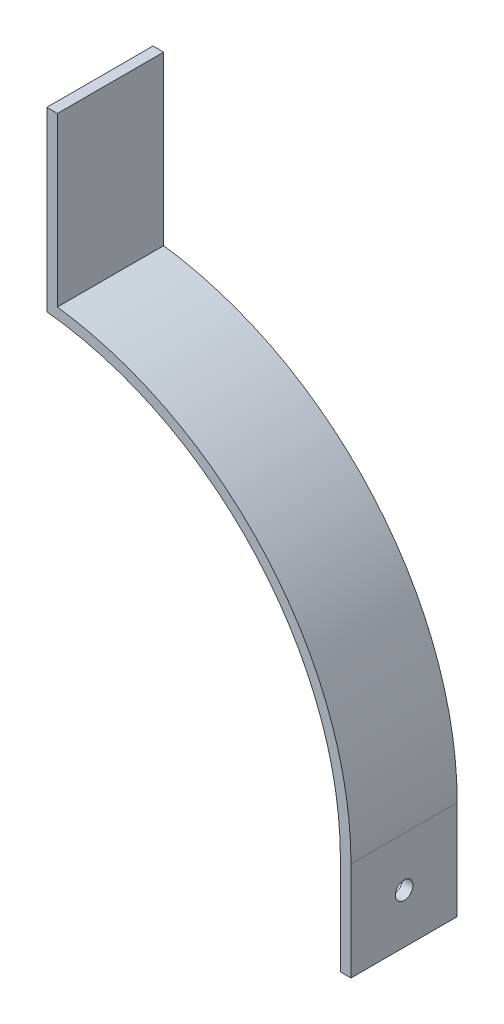
ISO-10303-21;
HEADER;
FILE_DESCRIPTION(('STEP AP214'),'2;1');
FILE_NAME('part.step','',(''),(''),'','','');
FILE_SCHEMA(('AUTOMOTIVE_DESIGN { 1 0 10303 214 1 1 1 1 }'));
ENDSEC;
DATA;
#1=APPLICATION_CONTEXT('core data for automotive mechanical design processes');
#2=APPLICATION_PROTOCOL_DEFINITION('international standard','automotive_design',2000,#1);
#3=PRODUCT_CONTEXT('',#1,'mechanical');
#4=PRODUCT('Part','Part','',(#3));
#5=PRODUCT_RELATED_PRODUCT_CATEGORY('part','',(#4));
#6=PRODUCT_DEFINITION_FORMATION('','',#4);
#7=PRODUCT_DEFINITION_CONTEXT('part definition',#1,'design');
#8=PRODUCT_DEFINITION('design','',#6,#7);
#9=PRODUCT_DEFINITION_SHAPE('','',#8);
#10=(LENGTH_UNIT() NAMED_UNIT(*) SI_UNIT(.MILLI.,.METRE.));
#11=(NAMED_UNIT(*) PLANE_ANGLE_UNIT() SI_UNIT($,.RADIAN.));
#12=(NAMED_UNIT(*) SI_UNIT($,.STERADIAN.) SOLID_ANGLE_UNIT());
#13=UNCERTAINTY_MEASURE_WITH_UNIT(LENGTH_MEASURE(1.E-05),#10,'distance_accuracy_value','');
#14=(GEOMETRIC_REPRESENTATION_CONTEXT(3) GLOBAL_UNCERTAINTY_ASSIGNED_CONTEXT((#13)) GLOBAL_UNIT_ASSIGNED_CONTEXT((#10,
#11,#12)) REPRESENTATION_CONTEXT('',''));
#15=CARTESIAN_POINT('',(0.,0.,0.));
#16=DIRECTION('',(0.,0.,1.));
#17=DIRECTION('',(1.,0.,0.));
#18=AXIS2_PLACEMENT_3D('',#15,#16,#17);
#19=CARTESIAN_POINT('',(0.,50.,30.));
#20=DIRECTION('',(0.,-1.,0.));
#21=DIRECTION('',(0.,0.,-1.));
#22=AXIS2_PLACEMENT_3D('',#19,#20,#21);
#23=PLANE('',#22);
#24=DIRECTION('',(-1.,0.,0.));
#25=VECTOR('',#24,1.);
#26=CARTESIAN_POINT('',(0.,50.,0.));
#27=LINE('',#26,#25);
#28=CARTESIAN_POINT('',(3.,50.,0.));
#29=VERTEX_POINT('',#28);
#30=CARTESIAN_POINT('',(0.,50.,0.));
#31=VERTEX_POINT('',#30);
#32=EDGE_CURVE('E129',#29,#31,#27,.T.);
#33=ORIENTED_EDGE('',*,*,#32,.T.);
#34=DIRECTION('',(0.,0.,-1.));
#35=VECTOR('',#34,1.);
#36=CARTESIAN_POINT('',(0.,50.,30.));
#37=LINE('',#36,#35);
#38=CARTESIAN_POINT('',(0.,50.,30.));
#39=VERTEX_POINT('',#38);
#40=EDGE_CURVE('E11',#39,#31,#37,.T.);
#41=ORIENTED_EDGE('',*,*,#40,.F.);
#42=DIRECTION('',(-1.,0.,0.));
#43=VECTOR('',#42,1.);
#44=CARTESIAN_POINT('',(0.,50.,30.));
#45=LINE('',#44,#43);
#46=CARTESIAN_POINT('',(3.,50.,30.));
#47=VERTEX_POINT('',#46);
#48=EDGE_CURVE('E144',#47,#39,#45,.T.);
#49=ORIENTED_EDGE('',*,*,#48,.F.);
#50=DIRECTION('',(0.,0.,-1.));
#51=VECTOR('',#50,1.);
#52=CARTESIAN_POINT('',(3.,50.,30.));
#53=LINE('',#52,#51);
#54=EDGE_CURVE('E125',#47,#29,#53,.T.);
#55=ORIENTED_EDGE('',*,*,#54,.T.);
#56=EDGE_LOOP('',(#33,#41,#49,#55));
#57=FACE_BOUND('',#56,.T.);
#58=ADVANCED_FACE('F33',(#57),#23,.F.);
#59=CARTESIAN_POINT('',(0.,50.,30.));
#60=DIRECTION('',(1.,0.,0.));
#61=DIRECTION('',(0.,0.,-1.));
#62=AXIS2_PLACEMENT_3D('',#59,#60,#61);
#63=PLANE('',#62);
#64=DIRECTION('',(0.,-1.,0.));
#65=VECTOR('',#64,1.);
#66=CARTESIAN_POINT('',(0.,50.,0.));
#67=LINE('',#66,#65);
#68=CARTESIAN_POINT('',(0.,0.,0.));
#69=VERTEX_POINT('',#68);
#70=EDGE_CURVE('E132',#31,#69,#67,.T.);
#71=ORIENTED_EDGE('',*,*,#70,.T.);
#72=DIRECTION('',(0.,0.,-1.));
#73=VECTOR('',#72,1.);
#74=CARTESIAN_POINT('',(0.,0.,30.));
#75=LINE('',#74,#73);
#76=CARTESIAN_POINT('',(0.,0.,30.));
#77=VERTEX_POINT('',#76);
#78=EDGE_CURVE('E41',#77,#69,#75,.T.);
#79=ORIENTED_EDGE('',*,*,#78,.F.);
#80=DIRECTION('',(0.,-1.,0.));
#81=VECTOR('',#80,1.);
#82=CARTESIAN_POINT('',(0.,50.,30.));
#83=LINE('',#82,#81);
#84=EDGE_CURVE('E92',#39,#77,#83,.T.);
#85=ORIENTED_EDGE('',*,*,#84,.F.);
#86=ORIENTED_EDGE('',*,*,#40,.T.);
#87=EDGE_LOOP('',(#71,#79,#85,#86));
#88=FACE_BOUND('',#87,.T.);
#89=ADVANCED_FACE('F196',(#88),#63,.F.);
#90=CARTESIAN_POINT('',(-9.70418631130232,-92.1155372334908,30.));
#91=DIRECTION('',(0.,0.,-1.));
#92=DIRECTION('',(-1.,0.,0.));
#93=AXIS2_PLACEMENT_3D('',#90,#91,#92);
#94=CYLINDRICAL_SURFACE('',#93,92.6252850563986);
#95=CARTESIAN_POINT('',(-9.70418631130232,-92.1155372334908,0.));
#96=DIRECTION('',(0.,0.,-1.));
#97=DIRECTION('',(1.,0.,0.));
#98=AXIS2_PLACEMENT_3D('',#95,#96,#97);
#99=CIRCLE('',#98,92.6252850563986);
#100=CARTESIAN_POINT('',(82.9210987450963,-92.1155372334908,0.));
#101=VERTEX_POINT('',#100);
#102=EDGE_CURVE('E135',#69,#101,#99,.T.);
#103=ORIENTED_EDGE('',*,*,#102,.T.);
#104=DIRECTION('',(0.,0.,-1.));
#105=VECTOR('',#104,1.);
#106=CARTESIAN_POINT('',(82.9210987450963,-92.1155372334908,30.));
#107=LINE('',#106,#105);
#108=CARTESIAN_POINT('',(82.9210987450963,-92.1155372334908,30.));
#109=VERTEX_POINT('',#108);
#110=EDGE_CURVE('E151',#109,#101,#107,.T.);
#111=ORIENTED_EDGE('',*,*,#110,.F.);
#112=CARTESIAN_POINT('',(-9.70418631130232,-92.1155372334908,30.));
#113=DIRECTION('',(0.,0.,-1.));
#114=DIRECTION('',(1.,0.,0.));
#115=AXIS2_PLACEMENT_3D('',#112,#113,#114);
#116=CIRCLE('',#115,92.6252850563986);
#117=EDGE_CURVE('E159',#77,#109,#116,.T.);
#118=ORIENTED_EDGE('',*,*,#117,.F.);
#119=ORIENTED_EDGE('',*,*,#78,.T.);
#120=EDGE_LOOP('',(#103,#111,#118,#119));
#121=FACE_BOUND('',#120,.T.);
#122=ADVANCED_FACE('F157',(#121),#94,.F.);
#123=CARTESIAN_POINT('',(82.9210987450963,-92.1155372334908,30.));
#124=DIRECTION('',(1.,0.,0.));
#125=DIRECTION('',(0.,0.,-1.));
#126=AXIS2_PLACEMENT_3D('',#123,#124,#125);
#127=PLANE('',#126);
#128=CARTESIAN_POINT('',(82.9210987450963,-106.057768616745,15.));
#129=DIRECTION('',(1.,0.,0.));
#130=DIRECTION('',(0.,0.,-1.));
#131=AXIS2_PLACEMENT_3D('',#128,#129,#130);
#132=CIRCLE('',#131,2.5);
#133=CARTESIAN_POINT('',(82.9210987450963,-106.057768616745,12.5));
#134=VERTEX_POINT('',#133);
#135=EDGE_CURVE('E133',#134,#134,#132,.T.);
#136=ORIENTED_EDGE('',*,*,#135,.T.);
#137=EDGE_LOOP('',(#136));
#138=FACE_BOUND('',#137,.T.);
#139=DIRECTION('',(0.,-1.,0.));
#140=VECTOR('',#139,1.);
#141=CARTESIAN_POINT('',(82.9210987450963,-92.1155372334908,0.));
#142=LINE('',#141,#140);
#143=CARTESIAN_POINT('',(82.9210987450963,-120.,0.));
#144=VERTEX_POINT('',#143);
#145=EDGE_CURVE('E137',#101,#144,#142,.T.);
#146=ORIENTED_EDGE('',*,*,#145,.T.);
#147=DIRECTION('',(0.,0.,-1.));
#148=VECTOR('',#147,1.);
#149=CARTESIAN_POINT('',(82.9210987450963,-120.,30.));
#150=LINE('',#149,#148);
#151=CARTESIAN_POINT('',(82.9210987450963,-120.,30.));
#152=VERTEX_POINT('',#151);
#153=EDGE_CURVE('E148',#152,#144,#150,.T.);
#154=ORIENTED_EDGE('',*,*,#153,.F.);
#155=DIRECTION('',(0.,-1.,0.));
#156=VECTOR('',#155,1.);
#157=CARTESIAN_POINT('',(82.9210987450963,-92.1155372334908,30.));
#158=LINE('',#157,#156);
#159=EDGE_CURVE('E171',#109,#152,#158,.T.);
#160=ORIENTED_EDGE('',*,*,#159,.F.);
#161=ORIENTED_EDGE('',*,*,#110,.T.);
#162=EDGE_LOOP('',(#146,#154,#160,#161));
#163=FACE_BOUND('',#162,.T.);
#164=ADVANCED_FACE('F167',(#138,#163),#127,.F.);
#165=CARTESIAN_POINT('',(82.9210987450963,-120.,30.));
#166=DIRECTION('',(0.,1.,0.));
#167=DIRECTION('',(0.,0.,1.));
#168=AXIS2_PLACEMENT_3D('',#165,#166,#167);
#169=PLANE('',#168);
#170=DIRECTION('',(1.,0.,0.));
#171=VECTOR('',#170,1.);
#172=CARTESIAN_POINT('',(82.9210987450963,-120.,0.));
#173=LINE('',#172,#171);
#174=CARTESIAN_POINT('',(85.9210987450963,-120.,0.));
#175=VERTEX_POINT('',#174);
#176=EDGE_CURVE('E139',#144,#175,#173,.T.);
#177=ORIENTED_EDGE('',*,*,#176,.T.);
#178=DIRECTION('',(0.,0.,-1.));
#179=VECTOR('',#178,1.);
#180=CARTESIAN_POINT('',(85.9210987450963,-120.,30.));
#181=LINE('',#180,#179);
#182=CARTESIAN_POINT('',(85.9210987450963,-120.,30.));
#183=VERTEX_POINT('',#182);
#184=EDGE_CURVE('E120',#183,#175,#181,.T.);
#185=ORIENTED_EDGE('',*,*,#184,.F.);
#186=DIRECTION('',(1.,0.,0.));
#187=VECTOR('',#186,1.);
#188=CARTESIAN_POINT('',(82.9210987450963,-120.,30.));
#189=LINE('',#188,#187);
#190=EDGE_CURVE('E111',#152,#183,#189,.T.);
#191=ORIENTED_EDGE('',*,*,#190,.F.);
#192=ORIENTED_EDGE('',*,*,#153,.T.);
#193=EDGE_LOOP('',(#177,#185,#191,#192));
#194=FACE_BOUND('',#193,.T.);
#195=ADVANCED_FACE('F170',(#194),#169,.F.);
#196=CARTESIAN_POINT('',(85.9210987450963,-92.1155372334908,30.));
#197=DIRECTION('',(-1.,0.,0.));
#198=DIRECTION('',(0.,0.,1.));
#199=AXIS2_PLACEMENT_3D('',#196,#197,#198);
#200=PLANE('',#199);
#201=CARTESIAN_POINT('',(85.9210987450962,-106.057768616745,15.));
#202=DIRECTION('',(1.,0.,0.));
#203=DIRECTION('',(0.,1.,0.));
#204=AXIS2_PLACEMENT_3D('',#201,#202,#203);
#205=CIRCLE('',#204,2.5);
#206=CARTESIAN_POINT('',(85.9210987450962,-103.557768616745,15.));
#207=VERTEX_POINT('',#206);
#208=EDGE_CURVE('E179',#207,#207,#205,.T.);
#209=ORIENTED_EDGE('',*,*,#208,.F.);
#210=EDGE_LOOP('',(#209));
#211=FACE_BOUND('',#210,.T.);
#212=DIRECTION('',(0.,1.,0.));
#213=VECTOR('',#212,1.);
#214=CARTESIAN_POINT('',(85.9210987450963,-92.1155372334908,0.));
#215=LINE('',#214,#213);
#216=CARTESIAN_POINT('',(85.9210987450963,-92.1155372334908,0.));
#217=VERTEX_POINT('',#216);
#218=EDGE_CURVE('E119',#175,#217,#215,.T.);
#219=ORIENTED_EDGE('',*,*,#218,.T.);
#220=DIRECTION('',(0.,0.,-1.));
#221=VECTOR('',#220,1.);
#222=CARTESIAN_POINT('',(85.9210987450963,-92.1155372334908,30.));
#223=LINE('',#222,#221);
#224=CARTESIAN_POINT('',(85.9210987450963,-92.1155372334908,30.));
#225=VERTEX_POINT('',#224);
#226=EDGE_CURVE('E116',#225,#217,#223,.T.);
#227=ORIENTED_EDGE('',*,*,#226,.F.);
#228=DIRECTION('',(0.,1.,0.));
#229=VECTOR('',#228,1.);
#230=CARTESIAN_POINT('',(85.9210987450963,-92.1155372334908,30.));
#231=LINE('',#230,#229);
#232=EDGE_CURVE('E105',#183,#225,#231,.T.);
#233=ORIENTED_EDGE('',*,*,#232,.F.);
#234=ORIENTED_EDGE('',*,*,#184,.T.);
#235=EDGE_LOOP('',(#219,#227,#233,#234));
#236=FACE_BOUND('',#235,.T.);
#237=ADVANCED_FACE('F117',(#211,#236),#200,.F.);
#238=CARTESIAN_POINT('',(-9.70418631130232,-92.1155372334908,30.));
#239=DIRECTION('',(0.,0.,-1.));
#240=DIRECTION('',(-1.,0.,0.));
#241=AXIS2_PLACEMENT_3D('',#238,#239,#240);
#242=CYLINDRICAL_SURFACE('',#241,95.6252850563986);
#243=CARTESIAN_POINT('',(-9.70418631130232,-92.1155372334908,0.));
#244=DIRECTION('',(0.,0.,1.));
#245=DIRECTION('',(1.,0.,0.));
#246=AXIS2_PLACEMENT_3D('',#243,#244,#245);
#247=CIRCLE('',#246,95.6252850563986);
#248=CARTESIAN_POINT('',(3.00000000000001,2.66209088773413,0.));
#249=VERTEX_POINT('',#248);
#250=EDGE_CURVE('E78',#217,#249,#247,.T.);
#251=ORIENTED_EDGE('',*,*,#250,.T.);
#252=DIRECTION('',(0.,0.,-1.));
#253=VECTOR('',#252,1.);
#254=CARTESIAN_POINT('',(3.00000000000001,2.66209088773413,30.));
#255=LINE('',#254,#253);
#256=CARTESIAN_POINT('',(3.00000000000001,2.66209088773413,30.));
#257=VERTEX_POINT('',#256);
#258=EDGE_CURVE('E121',#257,#249,#255,.T.);
#259=ORIENTED_EDGE('',*,*,#258,.F.);
#260=CARTESIAN_POINT('',(-9.70418631130232,-92.1155372334908,30.));
#261=DIRECTION('',(0.,0.,1.));
#262=DIRECTION('',(1.,0.,0.));
#263=AXIS2_PLACEMENT_3D('',#260,#261,#262);
#264=CIRCLE('',#263,95.6252850563986);
#265=EDGE_CURVE('E109',#225,#257,#264,.T.);
#266=ORIENTED_EDGE('',*,*,#265,.F.);
#267=ORIENTED_EDGE('',*,*,#226,.T.);
#268=EDGE_LOOP('',(#251,#259,#266,#267));
#269=FACE_BOUND('',#268,.T.);
#270=ADVANCED_FACE('F123',(#269),#242,.T.);
#271=CARTESIAN_POINT('',(3.,50.,30.));
#272=DIRECTION('',(-1.,0.,0.));
#273=DIRECTION('',(0.,-1.,0.));
#274=AXIS2_PLACEMENT_3D('',#271,#272,#273);
#275=PLANE('',#274);
#276=DIRECTION('',(0.,1.,0.));
#277=VECTOR('',#276,1.);
#278=CARTESIAN_POINT('',(3.,50.,0.));
#279=LINE('',#278,#277);
#280=EDGE_CURVE('E84',#249,#29,#279,.T.);
#281=ORIENTED_EDGE('',*,*,#280,.T.);
#282=ORIENTED_EDGE('',*,*,#54,.F.);
#283=DIRECTION('',(0.,1.,0.));
#284=VECTOR('',#283,1.);
#285=CARTESIAN_POINT('',(3.,50.,30.));
#286=LINE('',#285,#284);
#287=EDGE_CURVE('E49',#257,#47,#286,.T.);
#288=ORIENTED_EDGE('',*,*,#287,.F.);
#289=ORIENTED_EDGE('',*,*,#258,.T.);
#290=EDGE_LOOP('',(#281,#282,#288,#289));
#291=FACE_BOUND('',#290,.T.);
#292=ADVANCED_FACE('F192',(#291),#275,.F.);
#293=CARTESIAN_POINT('',(-9.70418631130232,-92.1155372334908,30.));
#294=DIRECTION('',(0.,0.,1.));
#295=DIRECTION('',(1.,0.,0.));
#296=AXIS2_PLACEMENT_3D('',#293,#294,#295);
#297=PLANE('',#296);
#298=ORIENTED_EDGE('',*,*,#48,.T.);
#299=ORIENTED_EDGE('',*,*,#84,.T.);
#300=ORIENTED_EDGE('',*,*,#117,.T.);
#301=ORIENTED_EDGE('',*,*,#159,.T.);
#302=ORIENTED_EDGE('',*,*,#190,.T.);
#303=ORIENTED_EDGE('',*,*,#232,.T.);
#304=ORIENTED_EDGE('',*,*,#265,.T.);
#305=ORIENTED_EDGE('',*,*,#287,.T.);
#306=EDGE_LOOP('',(#298,#299,#300,#301,#302,#303,#304,#305));
#307=FACE_BOUND('',#306,.T.);
#308=ADVANCED_FACE('F107',(#307),#297,.T.);
#309=CARTESIAN_POINT('',(-9.70418631130232,-92.1155372334908,0.));
#310=DIRECTION('',(0.,0.,1.));
#311=DIRECTION('',(1.,0.,0.));
#312=AXIS2_PLACEMENT_3D('',#309,#310,#311);
#313=PLANE('',#312);
#314=ORIENTED_EDGE('',*,*,#32,.F.);
#315=ORIENTED_EDGE('',*,*,#280,.F.);
#316=ORIENTED_EDGE('',*,*,#250,.F.);
#317=ORIENTED_EDGE('',*,*,#218,.F.);
#318=ORIENTED_EDGE('',*,*,#176,.F.);
#319=ORIENTED_EDGE('',*,*,#145,.F.);
#320=ORIENTED_EDGE('',*,*,#102,.F.);
#321=ORIENTED_EDGE('',*,*,#70,.F.);
#322=EDGE_LOOP('',(#314,#315,#316,#317,#318,#319,#320,#321));
#323=FACE_BOUND('',#322,.T.);
#324=ADVANCED_FACE('F163',(#323),#313,.F.);
#325=CARTESIAN_POINT('',(55.9210987450963,-106.057768616745,15.));
#326=DIRECTION('',(1.,0.,0.));
#327=DIRECTION('',(0.,1.,0.));
#328=AXIS2_PLACEMENT_3D('',#325,#326,#327);
#329=CYLINDRICAL_SURFACE('',#328,2.5);
#330=ORIENTED_EDGE('',*,*,#208,.T.);
#331=EDGE_LOOP('',(#330));
#332=FACE_BOUND('',#331,.T.);
#333=ORIENTED_EDGE('',*,*,#135,.F.);
#334=EDGE_LOOP('',(#333));
#335=FACE_BOUND('',#334,.T.);
#336=ADVANCED_FACE('F183',(#332,#335),#329,.F.);
#337=CLOSED_SHELL('',(#58,#89,#122,#164,#195,#237,#270,#292,#308,#324,#336));
#338=MANIFOLD_SOLID_BREP('B2',#337);
#339=ADVANCED_BREP_SHAPE_REPRESENTATION('',(#18,#338),#14);
#340=SHAPE_DEFINITION_REPRESENTATION(#9,#339);
ENDSEC;
END-ISO-10303-21;
